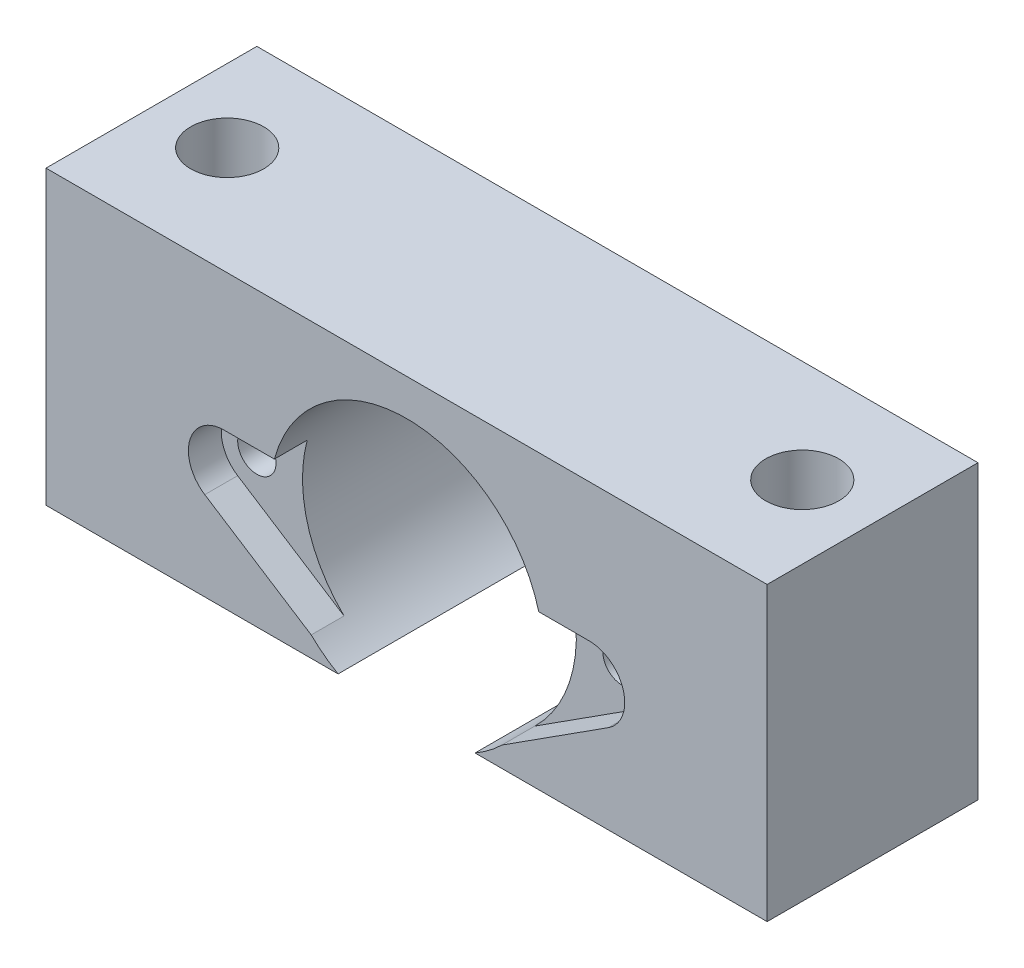
ISO-10303-21;
HEADER;
FILE_DESCRIPTION(('STEP AP214'),'2;1');
FILE_NAME('part.step','',(''),(''),'','','');
FILE_SCHEMA(('AUTOMOTIVE_DESIGN { 1 0 10303 214 1 1 1 1 }'));
ENDSEC;
DATA;
#1=APPLICATION_CONTEXT('core data for automotive mechanical design processes');
#2=APPLICATION_PROTOCOL_DEFINITION('international standard','automotive_design',2000,#1);
#3=PRODUCT_CONTEXT('',#1,'mechanical');
#4=PRODUCT('Part','Part','',(#3));
#5=PRODUCT_RELATED_PRODUCT_CATEGORY('part','',(#4));
#6=PRODUCT_DEFINITION_FORMATION('','',#4);
#7=PRODUCT_DEFINITION_CONTEXT('part definition',#1,'design');
#8=PRODUCT_DEFINITION('design','',#6,#7);
#9=PRODUCT_DEFINITION_SHAPE('','',#8);
#10=(LENGTH_UNIT() NAMED_UNIT(*) SI_UNIT(.MILLI.,.METRE.));
#11=(NAMED_UNIT(*) PLANE_ANGLE_UNIT() SI_UNIT($,.RADIAN.));
#12=(NAMED_UNIT(*) SI_UNIT($,.STERADIAN.) SOLID_ANGLE_UNIT());
#13=UNCERTAINTY_MEASURE_WITH_UNIT(LENGTH_MEASURE(1.E-05),#10,'distance_accuracy_value','');
#14=(GEOMETRIC_REPRESENTATION_CONTEXT(3) GLOBAL_UNCERTAINTY_ASSIGNED_CONTEXT((#13)) GLOBAL_UNIT_ASSIGNED_CONTEXT((#10,
#11,#12)) REPRESENTATION_CONTEXT('',''));
#15=CARTESIAN_POINT('',(0.,0.,0.));
#16=DIRECTION('',(0.,0.,1.));
#17=DIRECTION('',(1.,0.,0.));
#18=AXIS2_PLACEMENT_3D('',#15,#16,#17);
#19=CARTESIAN_POINT('',(19.75,9.49999999999992,-47.1207938497077));
#20=DIRECTION('',(-1.,0.,0.));
#21=DIRECTION('',(0.,0.,1.));
#22=AXIS2_PLACEMENT_3D('',#19,#20,#21);
#23=PLANE('',#22);
#24=DIRECTION('',(0.,-1.,0.));
#25=VECTOR('',#24,1.);
#26=CARTESIAN_POINT('',(19.75,9.49999999999992,-35.5707938497077));
#27=LINE('',#26,#25);
#28=CARTESIAN_POINT('',(19.75,9.49999999999992,-35.5707938497077));
#29=VERTEX_POINT('',#28);
#30=CARTESIAN_POINT('',(19.75,-6.49519052838343,-35.5707938497077));
#31=VERTEX_POINT('',#30);
#32=EDGE_CURVE('E179',#29,#31,#27,.T.);
#33=ORIENTED_EDGE('',*,*,#32,.T.);
#34=DIRECTION('',(0.,0.,1.));
#35=VECTOR('',#34,1.);
#36=CARTESIAN_POINT('',(19.75,-6.49519052838343,-47.1207938497077));
#37=LINE('',#36,#35);
#38=CARTESIAN_POINT('',(19.75,-6.49519052838343,-47.1207938497077));
#39=VERTEX_POINT('',#38);
#40=EDGE_CURVE('E11',#39,#31,#37,.T.);
#41=ORIENTED_EDGE('',*,*,#40,.F.);
#42=DIRECTION('',(0.,-1.,0.));
#43=VECTOR('',#42,1.);
#44=CARTESIAN_POINT('',(19.75,9.49999999999992,-47.1207938497077));
#45=LINE('',#44,#43);
#46=CARTESIAN_POINT('',(19.75,9.49999999999992,-47.1207938497077));
#47=VERTEX_POINT('',#46);
#48=EDGE_CURVE('E210',#47,#39,#45,.T.);
#49=ORIENTED_EDGE('',*,*,#48,.F.);
#50=DIRECTION('',(0.,0.,1.));
#51=VECTOR('',#50,1.);
#52=CARTESIAN_POINT('',(19.75,9.49999999999992,-47.1207938497077));
#53=LINE('',#52,#51);
#54=EDGE_CURVE('E225',#47,#29,#53,.T.);
#55=ORIENTED_EDGE('',*,*,#54,.T.);
#56=EDGE_LOOP('',(#33,#41,#49,#55));
#57=FACE_BOUND('',#56,.T.);
#58=ADVANCED_FACE('F39',(#57),#23,.F.);
#59=CARTESIAN_POINT('',(19.75,-6.49519052838343,-47.1207938497077));
#60=DIRECTION('',(0.,1.,0.));
#61=DIRECTION('',(0.,0.,1.));
#62=AXIS2_PLACEMENT_3D('',#59,#60,#61);
#63=PLANE('',#62);
#64=CARTESIAN_POINT('',(15.75,-6.49519052838343,-41.4957938497077));
#65=DIRECTION('',(0.,1.,0.));
#66=DIRECTION('',(0.,0.,1.));
#67=AXIS2_PLACEMENT_3D('',#64,#65,#66);
#68=CIRCLE('',#67,2.00000000000001);
#69=CARTESIAN_POINT('',(15.75,-6.49519052838343,-39.4957938497077));
#70=VERTEX_POINT('',#69);
#71=EDGE_CURVE('E312',#70,#70,#68,.T.);
#72=ORIENTED_EDGE('',*,*,#71,.T.);
#73=EDGE_LOOP('',(#72));
#74=FACE_BOUND('',#73,.T.);
#75=DIRECTION('',(-1.,0.,0.));
#76=VECTOR('',#75,1.);
#77=CARTESIAN_POINT('',(19.75,-6.49519052838343,-35.5707938497077));
#78=LINE('',#77,#76);
#79=CARTESIAN_POINT('',(3.75,-6.49519052838343,-35.5707938497077));
#80=VERTEX_POINT('',#79);
#81=EDGE_CURVE('E228',#31,#80,#78,.T.);
#82=ORIENTED_EDGE('',*,*,#81,.T.);
#83=DIRECTION('',(0.,0.,1.));
#84=VECTOR('',#83,1.);
#85=CARTESIAN_POINT('',(3.75,-6.49519052838343,-47.1207938497077));
#86=LINE('',#85,#84);
#87=CARTESIAN_POINT('',(3.75,-6.49519052838343,-47.1207938497077));
#88=VERTEX_POINT('',#87);
#89=EDGE_CURVE('E46',#88,#80,#86,.T.);
#90=ORIENTED_EDGE('',*,*,#89,.F.);
#91=DIRECTION('',(-1.,0.,0.));
#92=VECTOR('',#91,1.);
#93=CARTESIAN_POINT('',(19.75,-6.49519052838343,-47.1207938497077));
#94=LINE('',#93,#92);
#95=EDGE_CURVE('E213',#39,#88,#94,.T.);
#96=ORIENTED_EDGE('',*,*,#95,.F.);
#97=ORIENTED_EDGE('',*,*,#40,.T.);
#98=EDGE_LOOP('',(#82,#90,#96,#97));
#99=FACE_BOUND('',#98,.T.);
#100=ADVANCED_FACE('F254',(#74,#99),#63,.F.);
#101=CARTESIAN_POINT('',(0.,-1.04791218874173E-13,-47.1207938497077));
#102=DIRECTION('',(0.,0.,1.));
#103=DIRECTION('',(1.,0.,0.));
#104=AXIS2_PLACEMENT_3D('',#101,#102,#103);
#105=CYLINDRICAL_SURFACE('',#104,7.50000000000003);
#106=DIRECTION('',(0.,0.,1.));
#107=VECTOR('',#106,1.);
#108=CARTESIAN_POINT('',(7.24206462274403,1.94999999999986,-37.3707938497077));
#109=LINE('',#108,#107);
#110=CARTESIAN_POINT('',(7.24206462274403,1.94999999999986,-37.3707938497077));
#111=VERTEX_POINT('',#110);
#112=CARTESIAN_POINT('',(7.24206462274403,1.94999999999986,-35.5707938497077));
#113=VERTEX_POINT('',#112);
#114=EDGE_CURVE('E141',#111,#113,#109,.T.);
#115=ORIENTED_EDGE('',*,*,#114,.T.);
#116=CARTESIAN_POINT('',(0.,-1.04791218874173E-13,-35.5707938497077));
#117=DIRECTION('',(0.,0.,-1.));
#118=DIRECTION('',(-1.,0.,0.));
#119=AXIS2_PLACEMENT_3D('',#116,#117,#118);
#120=CIRCLE('',#119,7.50000000000003);
#121=CARTESIAN_POINT('',(-7.24206462274403,1.94999999999985,-35.5707938497077));
#122=VERTEX_POINT('',#121);
#123=EDGE_CURVE('E236',#122,#113,#120,.T.);
#124=ORIENTED_EDGE('',*,*,#123,.F.);
#125=DIRECTION('',(0.,0.,1.));
#126=VECTOR('',#125,1.);
#127=CARTESIAN_POINT('',(-7.24206462274403,1.94999999999985,-37.3707938497077));
#128=LINE('',#127,#126);
#129=CARTESIAN_POINT('',(-7.24206462274403,1.94999999999985,-37.3707938497077));
#130=VERTEX_POINT('',#129);
#131=EDGE_CURVE('E61',#130,#122,#128,.T.);
#132=ORIENTED_EDGE('',*,*,#131,.F.);
#133=CARTESIAN_POINT('',(0.,-1.04791218874173E-13,-37.3707938497077));
#134=DIRECTION('',(0.,0.,1.));
#135=DIRECTION('',(1.,0.,0.));
#136=AXIS2_PLACEMENT_3D('',#133,#134,#135);
#137=CIRCLE('',#136,7.50000000000003);
#138=CARTESIAN_POINT('',(-5.2251691765045,-5.38029804721902,-37.3707938497077));
#139=VERTEX_POINT('',#138);
#140=EDGE_CURVE('E186',#139,#130,#137,.F.);
#141=ORIENTED_EDGE('',*,*,#140,.F.);
#142=DIRECTION('',(0.,0.,1.));
#143=VECTOR('',#142,1.);
#144=CARTESIAN_POINT('',(-5.2251691765045,-5.38029804721902,-37.3707938497077));
#145=LINE('',#144,#143);
#146=CARTESIAN_POINT('',(-5.2251691765045,-5.38029804721902,-35.5707938497077));
#147=VERTEX_POINT('',#146);
#148=EDGE_CURVE('E196',#139,#147,#145,.T.);
#149=ORIENTED_EDGE('',*,*,#148,.T.);
#150=CARTESIAN_POINT('',(-3.74999999999999,-6.49519052838343,-35.5707938497077));
#151=VERTEX_POINT('',#150);
#152=EDGE_CURVE('E232',#151,#147,#120,.T.);
#153=ORIENTED_EDGE('',*,*,#152,.F.);
#154=DIRECTION('',(0.,0.,1.));
#155=VECTOR('',#154,1.);
#156=CARTESIAN_POINT('',(-3.74999999999999,-6.49519052838343,-47.1207938497077));
#157=LINE('',#156,#155);
#158=CARTESIAN_POINT('',(-3.74999999999999,-6.49519052838343,-47.1207938497077));
#159=VERTEX_POINT('',#158);
#160=EDGE_CURVE('E249',#159,#151,#157,.T.);
#161=ORIENTED_EDGE('',*,*,#160,.F.);
#162=CARTESIAN_POINT('',(0.,-1.04791218874173E-13,-47.1207938497077));
#163=DIRECTION('',(0.,0.,-1.));
#164=DIRECTION('',(-1.,0.,0.));
#165=AXIS2_PLACEMENT_3D('',#162,#163,#164);
#166=CIRCLE('',#165,7.50000000000003);
#167=EDGE_CURVE('E216',#159,#88,#166,.T.);
#168=ORIENTED_EDGE('',*,*,#167,.T.);
#169=ORIENTED_EDGE('',*,*,#89,.T.);
#170=CARTESIAN_POINT('',(5.22516917650451,-5.38029804721902,-35.5707938497077));
#171=VERTEX_POINT('',#170);
#172=EDGE_CURVE('E231',#171,#80,#120,.T.);
#173=ORIENTED_EDGE('',*,*,#172,.F.);
#174=DIRECTION('',(0.,0.,1.));
#175=VECTOR('',#174,1.);
#176=CARTESIAN_POINT('',(5.22516917650451,-5.38029804721902,-37.3707938497077));
#177=LINE('',#176,#175);
#178=CARTESIAN_POINT('',(5.22516917650451,-5.38029804721902,-37.3707938497077));
#179=VERTEX_POINT('',#178);
#180=EDGE_CURVE('E53',#179,#171,#177,.T.);
#181=ORIENTED_EDGE('',*,*,#180,.F.);
#182=CARTESIAN_POINT('',(0.,-1.04791218874173E-13,-37.3707938497077));
#183=DIRECTION('',(0.,0.,1.));
#184=DIRECTION('',(1.,0.,0.));
#185=AXIS2_PLACEMENT_3D('',#182,#183,#184);
#186=CIRCLE('',#185,7.50000000000003);
#187=EDGE_CURVE('E159',#111,#179,#186,.F.);
#188=ORIENTED_EDGE('',*,*,#187,.F.);
#189=EDGE_LOOP('',(#115,#124,#132,#141,#149,#153,#161,#168,#169,#173,#181,#188));
#190=FACE_BOUND('',#189,.T.);
#191=ADVANCED_FACE('F163',(#190),#105,.F.);
#192=CARTESIAN_POINT('',(-3.74999999999999,-6.49519052838343,-47.1207938497077));
#193=DIRECTION('',(0.,1.,0.));
#194=DIRECTION('',(0.,0.,1.));
#195=AXIS2_PLACEMENT_3D('',#192,#193,#194);
#196=PLANE('',#195);
#197=CARTESIAN_POINT('',(-15.75,-6.49519052838343,-41.4957938497077));
#198=DIRECTION('',(0.,1.,0.));
#199=DIRECTION('',(0.,0.,1.));
#200=AXIS2_PLACEMENT_3D('',#197,#198,#199);
#201=CIRCLE('',#200,2.);
#202=CARTESIAN_POINT('',(-15.75,-6.49519052838343,-39.4957938497077));
#203=VERTEX_POINT('',#202);
#204=EDGE_CURVE('E328',#203,#203,#201,.T.);
#205=ORIENTED_EDGE('',*,*,#204,.T.);
#206=EDGE_LOOP('',(#205));
#207=FACE_BOUND('',#206,.T.);
#208=DIRECTION('',(-1.,0.,0.));
#209=VECTOR('',#208,1.);
#210=CARTESIAN_POINT('',(-3.74999999999999,-6.49519052838343,-35.5707938497077));
#211=LINE('',#210,#209);
#212=CARTESIAN_POINT('',(-19.75,-6.49519052838343,-35.5707938497077));
#213=VERTEX_POINT('',#212);
#214=EDGE_CURVE('E235',#151,#213,#211,.T.);
#215=ORIENTED_EDGE('',*,*,#214,.T.);
#216=DIRECTION('',(0.,0.,1.));
#217=VECTOR('',#216,1.);
#218=CARTESIAN_POINT('',(-19.75,-6.49519052838343,-47.1207938497077));
#219=LINE('',#218,#217);
#220=CARTESIAN_POINT('',(-19.75,-6.49519052838343,-47.1207938497077));
#221=VERTEX_POINT('',#220);
#222=EDGE_CURVE('E246',#221,#213,#219,.T.);
#223=ORIENTED_EDGE('',*,*,#222,.F.);
#224=DIRECTION('',(-1.,0.,0.));
#225=VECTOR('',#224,1.);
#226=CARTESIAN_POINT('',(-3.74999999999999,-6.49519052838343,-47.1207938497077));
#227=LINE('',#226,#225);
#228=EDGE_CURVE('E219',#159,#221,#227,.T.);
#229=ORIENTED_EDGE('',*,*,#228,.F.);
#230=ORIENTED_EDGE('',*,*,#160,.T.);
#231=EDGE_LOOP('',(#215,#223,#229,#230));
#232=FACE_BOUND('',#231,.T.);
#233=ADVANCED_FACE('F276',(#207,#232),#196,.F.);
#234=CARTESIAN_POINT('',(-19.75,-6.49519052838343,-47.1207938497077));
#235=DIRECTION('',(1.,0.,0.));
#236=DIRECTION('',(0.,1.,0.));
#237=AXIS2_PLACEMENT_3D('',#234,#235,#236);
#238=PLANE('',#237);
#239=DIRECTION('',(0.,1.,0.));
#240=VECTOR('',#239,1.);
#241=CARTESIAN_POINT('',(-19.75,-6.49519052838343,-35.5707938497077));
#242=LINE('',#241,#240);
#243=CARTESIAN_POINT('',(-19.75,9.49999999999992,-35.5707938497077));
#244=VERTEX_POINT('',#243);
#245=EDGE_CURVE('E238',#213,#244,#242,.T.);
#246=ORIENTED_EDGE('',*,*,#245,.T.);
#247=DIRECTION('',(0.,0.,1.));
#248=VECTOR('',#247,1.);
#249=CARTESIAN_POINT('',(-19.75,9.49999999999992,-47.1207938497077));
#250=LINE('',#249,#248);
#251=CARTESIAN_POINT('',(-19.75,9.49999999999992,-47.1207938497077));
#252=VERTEX_POINT('',#251);
#253=EDGE_CURVE('E243',#252,#244,#250,.T.);
#254=ORIENTED_EDGE('',*,*,#253,.F.);
#255=DIRECTION('',(0.,1.,0.));
#256=VECTOR('',#255,1.);
#257=CARTESIAN_POINT('',(-19.75,-6.49519052838343,-47.1207938497077));
#258=LINE('',#257,#256);
#259=EDGE_CURVE('E221',#221,#252,#258,.T.);
#260=ORIENTED_EDGE('',*,*,#259,.F.);
#261=ORIENTED_EDGE('',*,*,#222,.T.);
#262=EDGE_LOOP('',(#246,#254,#260,#261));
#263=FACE_BOUND('',#262,.T.);
#264=ADVANCED_FACE('F288',(#263),#238,.F.);
#265=CARTESIAN_POINT('',(-19.75,9.49999999999992,-47.1207938497077));
#266=DIRECTION('',(0.,-1.,0.));
#267=DIRECTION('',(0.,0.,-1.));
#268=AXIS2_PLACEMENT_3D('',#265,#266,#267);
#269=PLANE('',#268);
#270=CARTESIAN_POINT('',(-15.75,9.49999999999992,-41.4957938497077));
#271=DIRECTION('',(0.,1.,0.));
#272=DIRECTION('',(0.,0.,1.));
#273=AXIS2_PLACEMENT_3D('',#270,#271,#272);
#274=CIRCLE('',#273,2.);
#275=CARTESIAN_POINT('',(-15.75,9.49999999999992,-39.4957938497077));
#276=VERTEX_POINT('',#275);
#277=EDGE_CURVE('E317',#276,#276,#274,.T.);
#278=ORIENTED_EDGE('',*,*,#277,.F.);
#279=EDGE_LOOP('',(#278));
#280=FACE_BOUND('',#279,.T.);
#281=CARTESIAN_POINT('',(15.75,9.49999999999992,-41.4957938497077));
#282=DIRECTION('',(0.,1.,0.));
#283=DIRECTION('',(0.,0.,1.));
#284=AXIS2_PLACEMENT_3D('',#281,#282,#283);
#285=CIRCLE('',#284,2.00000000000001);
#286=CARTESIAN_POINT('',(15.75,9.49999999999992,-39.4957938497077));
#287=VERTEX_POINT('',#286);
#288=EDGE_CURVE('E314',#287,#287,#285,.T.);
#289=ORIENTED_EDGE('',*,*,#288,.F.);
#290=EDGE_LOOP('',(#289));
#291=FACE_BOUND('',#290,.T.);
#292=DIRECTION('',(1.,0.,0.));
#293=VECTOR('',#292,1.);
#294=CARTESIAN_POINT('',(-19.75,9.49999999999992,-35.5707938497077));
#295=LINE('',#294,#293);
#296=EDGE_CURVE('E214',#244,#29,#295,.T.);
#297=ORIENTED_EDGE('',*,*,#296,.T.);
#298=ORIENTED_EDGE('',*,*,#54,.F.);
#299=DIRECTION('',(1.,0.,0.));
#300=VECTOR('',#299,1.);
#301=CARTESIAN_POINT('',(-19.75,9.49999999999992,-47.1207938497077));
#302=LINE('',#301,#300);
#303=EDGE_CURVE('E223',#252,#47,#302,.T.);
#304=ORIENTED_EDGE('',*,*,#303,.F.);
#305=ORIENTED_EDGE('',*,*,#253,.T.);
#306=EDGE_LOOP('',(#297,#298,#304,#305));
#307=FACE_BOUND('',#306,.T.);
#308=ADVANCED_FACE('F285',(#280,#291,#307),#269,.F.);
#309=CARTESIAN_POINT('',(0.,-1.04791218874173E-13,-47.1207938497077));
#310=DIRECTION('',(0.,0.,-1.));
#311=DIRECTION('',(-1.,0.,0.));
#312=AXIS2_PLACEMENT_3D('',#309,#310,#311);
#313=PLANE('',#312);
#314=ORIENTED_EDGE('',*,*,#48,.T.);
#315=ORIENTED_EDGE('',*,*,#95,.T.);
#316=ORIENTED_EDGE('',*,*,#167,.F.);
#317=ORIENTED_EDGE('',*,*,#228,.T.);
#318=ORIENTED_EDGE('',*,*,#259,.T.);
#319=ORIENTED_EDGE('',*,*,#303,.T.);
#320=EDGE_LOOP('',(#314,#315,#316,#317,#318,#319));
#321=FACE_BOUND('',#320,.T.);
#322=ADVANCED_FACE('F279',(#321),#313,.T.);
#323=CARTESIAN_POINT('',(0.,-1.04791218874173E-13,-35.5707938497077));
#324=DIRECTION('',(0.,0.,-1.));
#325=DIRECTION('',(-1.,0.,0.));
#326=AXIS2_PLACEMENT_3D('',#323,#324,#325);
#327=PLANE('',#326);
#328=ORIENTED_EDGE('',*,*,#123,.T.);
#329=DIRECTION('',(-1.,0.,0.));
#330=VECTOR('',#329,1.);
#331=CARTESIAN_POINT('',(0.,1.94999999999987,-35.5707938497077));
#332=LINE('',#331,#330);
#333=CARTESIAN_POINT('',(10.,1.94999999999985,-35.5707938497077));
#334=VERTEX_POINT('',#333);
#335=EDGE_CURVE('E147',#334,#113,#332,.T.);
#336=ORIENTED_EDGE('',*,*,#335,.F.);
#337=CARTESIAN_POINT('',(10.,-1.40475960755004E-13,-35.5707938497077));
#338=DIRECTION('',(0.,0.,1.));
#339=DIRECTION('',(1.,0.,0.));
#340=AXIS2_PLACEMENT_3D('',#337,#338,#339);
#341=CIRCLE('',#340,1.95);
#342=CARTESIAN_POINT('',(11.053,-1.6412467821752,-35.5707938497077));
#343=VERTEX_POINT('',#342);
#344=EDGE_CURVE('E161',#343,#334,#341,.T.);
#345=ORIENTED_EDGE('',*,*,#344,.F.);
#346=DIRECTION('',(0.841665016500033,0.54,0.));
#347=VECTOR('',#346,1.);
#348=CARTESIAN_POINT('',(3.96900000000007,-6.18623787127534,-35.5707938497077));
#349=LINE('',#348,#347);
#350=EDGE_CURVE('E172',#171,#343,#349,.T.);
#351=ORIENTED_EDGE('',*,*,#350,.F.);
#352=ORIENTED_EDGE('',*,*,#172,.T.);
#353=ORIENTED_EDGE('',*,*,#81,.F.);
#354=ORIENTED_EDGE('',*,*,#32,.F.);
#355=ORIENTED_EDGE('',*,*,#296,.F.);
#356=ORIENTED_EDGE('',*,*,#245,.F.);
#357=ORIENTED_EDGE('',*,*,#214,.F.);
#358=ORIENTED_EDGE('',*,*,#152,.T.);
#359=DIRECTION('',(0.841665016500033,-0.54,0.));
#360=VECTOR('',#359,1.);
#361=CARTESIAN_POINT('',(-3.96900000000006,-6.18623787127534,-35.5707938497077));
#362=LINE('',#361,#360);
#363=CARTESIAN_POINT('',(-11.053,-1.6412467821752,-35.5707938497077));
#364=VERTEX_POINT('',#363);
#365=EDGE_CURVE('E197',#364,#147,#362,.T.);
#366=ORIENTED_EDGE('',*,*,#365,.F.);
#367=CARTESIAN_POINT('',(-9.99999999999999,-1.44222963463114E-13,-35.5707938497077));
#368=DIRECTION('',(0.,0.,1.));
#369=DIRECTION('',(1.,0.,0.));
#370=AXIS2_PLACEMENT_3D('',#367,#368,#369);
#371=CIRCLE('',#370,1.95);
#372=CARTESIAN_POINT('',(-9.99999999999999,1.94999999999986,-35.5707938497077));
#373=VERTEX_POINT('',#372);
#374=EDGE_CURVE('E187',#373,#364,#371,.T.);
#375=ORIENTED_EDGE('',*,*,#374,.F.);
#376=DIRECTION('',(-1.,0.,0.));
#377=VECTOR('',#376,1.);
#378=CARTESIAN_POINT('',(0.,1.94999999999986,-35.5707938497077));
#379=LINE('',#378,#377);
#380=EDGE_CURVE('E199',#122,#373,#379,.T.);
#381=ORIENTED_EDGE('',*,*,#380,.F.);
#382=EDGE_LOOP('',(#328,#336,#345,#351,#352,#353,#354,#355,#356,#357,#358,#366,#375,#381));
#383=FACE_BOUND('',#382,.T.);
#384=ADVANCED_FACE('F258',(#383),#327,.F.);
#385=CARTESIAN_POINT('',(-3.96900000000006,-6.18623787127534,-37.3707938497077));
#386=DIRECTION('',(-0.54,-0.841665016500033,0.));
#387=DIRECTION('',(0.841665016500033,-0.54,0.));
#388=AXIS2_PLACEMENT_3D('',#385,#386,#387);
#389=PLANE('',#388);
#390=ORIENTED_EDGE('',*,*,#365,.T.);
#391=ORIENTED_EDGE('',*,*,#148,.F.);
#392=DIRECTION('',(0.841665016500033,-0.54,0.));
#393=VECTOR('',#392,1.);
#394=CARTESIAN_POINT('',(-3.96900000000006,-6.18623787127534,-37.3707938497077));
#395=LINE('',#394,#393);
#396=CARTESIAN_POINT('',(-11.053,-1.6412467821752,-37.3707938497077));
#397=VERTEX_POINT('',#396);
#398=EDGE_CURVE('E183',#397,#139,#395,.T.);
#399=ORIENTED_EDGE('',*,*,#398,.F.);
#400=DIRECTION('',(0.,0.,1.));
#401=VECTOR('',#400,1.);
#402=CARTESIAN_POINT('',(-11.053,-1.6412467821752,-37.3707938497077));
#403=LINE('',#402,#401);
#404=EDGE_CURVE('E173',#397,#364,#403,.T.);
#405=ORIENTED_EDGE('',*,*,#404,.T.);
#406=EDGE_LOOP('',(#390,#391,#399,#405));
#407=FACE_BOUND('',#406,.T.);
#408=ADVANCED_FACE('F269',(#407),#389,.F.);
#409=CARTESIAN_POINT('',(-9.99999999999999,-1.44222963463114E-13,-37.3707938497077));
#410=DIRECTION('',(0.,0.,1.));
#411=DIRECTION('',(1.,0.,0.));
#412=AXIS2_PLACEMENT_3D('',#409,#410,#411);
#413=CYLINDRICAL_SURFACE('',#412,1.95);
#414=ORIENTED_EDGE('',*,*,#374,.T.);
#415=ORIENTED_EDGE('',*,*,#404,.F.);
#416=CARTESIAN_POINT('',(-9.99999999999999,-1.44222963463114E-13,-37.3707938497077));
#417=DIRECTION('',(0.,0.,1.));
#418=DIRECTION('',(1.,0.,0.));
#419=AXIS2_PLACEMENT_3D('',#416,#417,#418);
#420=CIRCLE('',#419,1.95);
#421=CARTESIAN_POINT('',(-9.99999999999999,1.94999999999986,-37.3707938497077));
#422=VERTEX_POINT('',#421);
#423=EDGE_CURVE('E193',#422,#397,#420,.T.);
#424=ORIENTED_EDGE('',*,*,#423,.F.);
#425=DIRECTION('',(0.,0.,1.));
#426=VECTOR('',#425,1.);
#427=CARTESIAN_POINT('',(-9.99999999999999,1.94999999999986,-37.3707938497077));
#428=LINE('',#427,#426);
#429=EDGE_CURVE('E205',#422,#373,#428,.T.);
#430=ORIENTED_EDGE('',*,*,#429,.T.);
#431=EDGE_LOOP('',(#414,#415,#424,#430));
#432=FACE_BOUND('',#431,.T.);
#433=ADVANCED_FACE('F345',(#432),#413,.F.);
#434=CARTESIAN_POINT('',(0.,1.94999999999986,-37.3707938497077));
#435=DIRECTION('',(0.,1.,0.));
#436=DIRECTION('',(-1.,0.,0.));
#437=AXIS2_PLACEMENT_3D('',#434,#435,#436);
#438=PLANE('',#437);
#439=ORIENTED_EDGE('',*,*,#380,.T.);
#440=ORIENTED_EDGE('',*,*,#429,.F.);
#441=DIRECTION('',(-1.,0.,0.));
#442=VECTOR('',#441,1.);
#443=CARTESIAN_POINT('',(0.,1.94999999999986,-37.3707938497077));
#444=LINE('',#443,#442);
#445=EDGE_CURVE('E190',#130,#422,#444,.T.);
#446=ORIENTED_EDGE('',*,*,#445,.F.);
#447=ORIENTED_EDGE('',*,*,#131,.T.);
#448=EDGE_LOOP('',(#439,#440,#446,#447));
#449=FACE_BOUND('',#448,.T.);
#450=ADVANCED_FACE('F337',(#449),#438,.F.);
#451=CARTESIAN_POINT('',(0.,0.,-37.3707938497077));
#452=DIRECTION('',(0.,0.,1.));
#453=DIRECTION('',(1.,0.,0.));
#454=AXIS2_PLACEMENT_3D('',#451,#452,#453);
#455=PLANE('',#454);
#456=CARTESIAN_POINT('',(-9.99999999999999,-1.40288518418392E-13,-37.3707938497077));
#457=DIRECTION('',(0.,0.,1.));
#458=DIRECTION('',(1.,0.,0.));
#459=AXIS2_PLACEMENT_3D('',#456,#457,#458);
#460=CIRCLE('',#459,1.05);
#461=CARTESIAN_POINT('',(-8.94999999999999,-1.40288518418392E-13,-37.3707938497077));
#462=VERTEX_POINT('',#461);
#463=EDGE_CURVE('E200',#462,#462,#460,.T.);
#464=ORIENTED_EDGE('',*,*,#463,.F.);
#465=EDGE_LOOP('',(#464));
#466=FACE_BOUND('',#465,.T.);
#467=ORIENTED_EDGE('',*,*,#398,.T.);
#468=ORIENTED_EDGE('',*,*,#140,.T.);
#469=ORIENTED_EDGE('',*,*,#445,.T.);
#470=ORIENTED_EDGE('',*,*,#423,.T.);
#471=EDGE_LOOP('',(#467,#468,#469,#470));
#472=FACE_BOUND('',#471,.T.);
#473=ADVANCED_FACE('F265',(#466,#472),#455,.T.);
#474=CARTESIAN_POINT('',(0.,1.94999999999987,-37.3707938497077));
#475=DIRECTION('',(0.,1.,0.));
#476=DIRECTION('',(-1.,0.,0.));
#477=AXIS2_PLACEMENT_3D('',#474,#475,#476);
#478=PLANE('',#477);
#479=ORIENTED_EDGE('',*,*,#335,.T.);
#480=ORIENTED_EDGE('',*,*,#114,.F.);
#481=DIRECTION('',(-1.,0.,0.));
#482=VECTOR('',#481,1.);
#483=CARTESIAN_POINT('',(0.,1.94999999999987,-37.3707938497077));
#484=LINE('',#483,#482);
#485=CARTESIAN_POINT('',(10.,1.94999999999985,-37.3707938497077));
#486=VERTEX_POINT('',#485);
#487=EDGE_CURVE('E144',#486,#111,#484,.T.);
#488=ORIENTED_EDGE('',*,*,#487,.F.);
#489=DIRECTION('',(0.,0.,1.));
#490=VECTOR('',#489,1.);
#491=CARTESIAN_POINT('',(10.,1.94999999999985,-37.3707938497077));
#492=LINE('',#491,#490);
#493=EDGE_CURVE('E177',#486,#334,#492,.T.);
#494=ORIENTED_EDGE('',*,*,#493,.T.);
#495=EDGE_LOOP('',(#479,#480,#488,#494));
#496=FACE_BOUND('',#495,.T.);
#497=ADVANCED_FACE('F143',(#496),#478,.F.);
#498=CARTESIAN_POINT('',(10.,-1.40475960755004E-13,-37.3707938497077));
#499=DIRECTION('',(0.,0.,1.));
#500=DIRECTION('',(1.,0.,0.));
#501=AXIS2_PLACEMENT_3D('',#498,#499,#500);
#502=CYLINDRICAL_SURFACE('',#501,1.95);
#503=ORIENTED_EDGE('',*,*,#344,.T.);
#504=ORIENTED_EDGE('',*,*,#493,.F.);
#505=CARTESIAN_POINT('',(10.,-1.40475960755004E-13,-37.3707938497077));
#506=DIRECTION('',(0.,0.,1.));
#507=DIRECTION('',(1.,0.,0.));
#508=AXIS2_PLACEMENT_3D('',#505,#506,#507);
#509=CIRCLE('',#508,1.95);
#510=CARTESIAN_POINT('',(11.053,-1.6412467821752,-37.3707938497077));
#511=VERTEX_POINT('',#510);
#512=EDGE_CURVE('E152',#511,#486,#509,.T.);
#513=ORIENTED_EDGE('',*,*,#512,.F.);
#514=DIRECTION('',(0.,0.,1.));
#515=VECTOR('',#514,1.);
#516=CARTESIAN_POINT('',(11.053,-1.6412467821752,-37.3707938497077));
#517=LINE('',#516,#515);
#518=EDGE_CURVE('E180',#511,#343,#517,.T.);
#519=ORIENTED_EDGE('',*,*,#518,.T.);
#520=EDGE_LOOP('',(#503,#504,#513,#519));
#521=FACE_BOUND('',#520,.T.);
#522=ADVANCED_FACE('F343',(#521),#502,.F.);
#523=CARTESIAN_POINT('',(3.96900000000007,-6.18623787127534,-37.3707938497077));
#524=DIRECTION('',(0.54,-0.841665016500033,0.));
#525=DIRECTION('',(0.841665016500033,0.54,0.));
#526=AXIS2_PLACEMENT_3D('',#523,#524,#525);
#527=PLANE('',#526);
#528=ORIENTED_EDGE('',*,*,#350,.T.);
#529=ORIENTED_EDGE('',*,*,#518,.F.);
#530=DIRECTION('',(0.841665016500033,0.54,0.));
#531=VECTOR('',#530,1.);
#532=CARTESIAN_POINT('',(3.96900000000007,-6.18623787127534,-37.3707938497077));
#533=LINE('',#532,#531);
#534=EDGE_CURVE('E165',#179,#511,#533,.T.);
#535=ORIENTED_EDGE('',*,*,#534,.F.);
#536=ORIENTED_EDGE('',*,*,#180,.T.);
#537=EDGE_LOOP('',(#528,#529,#535,#536));
#538=FACE_BOUND('',#537,.T.);
#539=ADVANCED_FACE('F399',(#538),#527,.F.);
#540=CARTESIAN_POINT('',(0.,0.,-37.3707938497077));
#541=DIRECTION('',(0.,0.,1.));
#542=DIRECTION('',(1.,0.,0.));
#543=AXIS2_PLACEMENT_3D('',#540,#541,#542);
#544=PLANE('',#543);
#545=ORIENTED_EDGE('',*,*,#487,.T.);
#546=ORIENTED_EDGE('',*,*,#187,.T.);
#547=ORIENTED_EDGE('',*,*,#534,.T.);
#548=ORIENTED_EDGE('',*,*,#512,.T.);
#549=EDGE_LOOP('',(#545,#546,#547,#548));
#550=FACE_BOUND('',#549,.T.);
#551=CARTESIAN_POINT('',(10.,-1.34991713756845E-13,-37.3707938497077));
#552=DIRECTION('',(0.,0.,1.));
#553=DIRECTION('',(1.,0.,0.));
#554=AXIS2_PLACEMENT_3D('',#551,#552,#553);
#555=CIRCLE('',#554,1.05);
#556=CARTESIAN_POINT('',(11.05,-1.34991713756845E-13,-37.3707938497077));
#557=VERTEX_POINT('',#556);
#558=EDGE_CURVE('E324',#557,#557,#555,.T.);
#559=ORIENTED_EDGE('',*,*,#558,.F.);
#560=EDGE_LOOP('',(#559));
#561=FACE_BOUND('',#560,.T.);
#562=ADVANCED_FACE('F156',(#550,#561),#544,.T.);
#563=CARTESIAN_POINT('',(10.,-1.34991713756845E-13,-41.5707938497077));
#564=DIRECTION('',(0.,0.,1.));
#565=DIRECTION('',(1.,0.,0.));
#566=AXIS2_PLACEMENT_3D('',#563,#564,#565);
#567=CYLINDRICAL_SURFACE('',#566,1.05);
#568=ORIENTED_EDGE('',*,*,#558,.T.);
#569=EDGE_LOOP('',(#568));
#570=FACE_BOUND('',#569,.T.);
#571=CARTESIAN_POINT('',(10.,-1.34991713756845E-13,-41.5707938497077));
#572=DIRECTION('',(0.,0.,1.));
#573=DIRECTION('',(1.,0.,0.));
#574=AXIS2_PLACEMENT_3D('',#571,#572,#573);
#575=CIRCLE('',#574,1.05);
#576=CARTESIAN_POINT('',(11.05,-1.34991713756845E-13,-41.5707938497077));
#577=VERTEX_POINT('',#576);
#578=EDGE_CURVE('E321',#577,#577,#575,.T.);
#579=ORIENTED_EDGE('',*,*,#578,.F.);
#580=EDGE_LOOP('',(#579));
#581=FACE_BOUND('',#580,.T.);
#582=ADVANCED_FACE('F419',(#570,#581),#567,.F.);
#583=CARTESIAN_POINT('',(0.,0.,-41.5707938497077));
#584=DIRECTION('',(0.,0.,1.));
#585=DIRECTION('',(1.,0.,0.));
#586=AXIS2_PLACEMENT_3D('',#583,#584,#585);
#587=PLANE('',#586);
#588=ORIENTED_EDGE('',*,*,#578,.T.);
#589=EDGE_LOOP('',(#588));
#590=FACE_BOUND('',#589,.T.);
#591=ADVANCED_FACE('F431',(#590),#587,.T.);
#592=CARTESIAN_POINT('',(-9.99999999999999,-1.40288518418392E-13,-41.5707938497077));
#593=DIRECTION('',(0.,0.,1.));
#594=DIRECTION('',(1.,0.,0.));
#595=AXIS2_PLACEMENT_3D('',#592,#593,#594);
#596=CYLINDRICAL_SURFACE('',#595,1.05);
#597=ORIENTED_EDGE('',*,*,#463,.T.);
#598=EDGE_LOOP('',(#597));
#599=FACE_BOUND('',#598,.T.);
#600=CARTESIAN_POINT('',(-9.99999999999999,-1.40288518418392E-13,-41.5707938497077));
#601=DIRECTION('',(0.,0.,1.));
#602=DIRECTION('',(1.,0.,0.));
#603=AXIS2_PLACEMENT_3D('',#600,#601,#602);
#604=CIRCLE('',#603,1.05);
#605=CARTESIAN_POINT('',(-8.94999999999999,-1.40288518418392E-13,-41.5707938497077));
#606=VERTEX_POINT('',#605);
#607=EDGE_CURVE('E325',#606,#606,#604,.T.);
#608=ORIENTED_EDGE('',*,*,#607,.F.);
#609=EDGE_LOOP('',(#608));
#610=FACE_BOUND('',#609,.T.);
#611=ADVANCED_FACE('F333',(#599,#610),#596,.F.);
#612=CARTESIAN_POINT('',(0.,0.,-41.5707938497077));
#613=DIRECTION('',(0.,0.,1.));
#614=DIRECTION('',(1.,0.,0.));
#615=AXIS2_PLACEMENT_3D('',#612,#613,#614);
#616=PLANE('',#615);
#617=ORIENTED_EDGE('',*,*,#607,.T.);
#618=EDGE_LOOP('',(#617));
#619=FACE_BOUND('',#618,.T.);
#620=ADVANCED_FACE('F450',(#619),#616,.T.);
#621=CARTESIAN_POINT('',(15.75,-6.49519052838343,-41.4957938497077));
#622=DIRECTION('',(0.,1.,0.));
#623=DIRECTION('',(0.,0.,1.));
#624=AXIS2_PLACEMENT_3D('',#621,#622,#623);
#625=CYLINDRICAL_SURFACE('',#624,2.00000000000001);
#626=ORIENTED_EDGE('',*,*,#71,.F.);
#627=EDGE_LOOP('',(#626));
#628=FACE_BOUND('',#627,.T.);
#629=ORIENTED_EDGE('',*,*,#288,.T.);
#630=EDGE_LOOP('',(#629));
#631=FACE_BOUND('',#630,.T.);
#632=ADVANCED_FACE('F458',(#628,#631),#625,.F.);
#633=CARTESIAN_POINT('',(-15.75,-6.49519052838343,-41.4957938497077));
#634=DIRECTION('',(0.,1.,0.));
#635=DIRECTION('',(0.,0.,1.));
#636=AXIS2_PLACEMENT_3D('',#633,#634,#635);
#637=CYLINDRICAL_SURFACE('',#636,2.);
#638=ORIENTED_EDGE('',*,*,#204,.F.);
#639=EDGE_LOOP('',(#638));
#640=FACE_BOUND('',#639,.T.);
#641=ORIENTED_EDGE('',*,*,#277,.T.);
#642=EDGE_LOOP('',(#641));
#643=FACE_BOUND('',#642,.T.);
#644=ADVANCED_FACE('F468',(#640,#643),#637,.F.);
#645=CLOSED_SHELL('',(#58,#100,#191,#233,#264,#308,#322,#384,#408,#433,#450,#473,#497,#522,#539,
#562,#582,#591,#611,#620,#632,#644));
#646=MANIFOLD_SOLID_BREP('B2',#645);
#647=ADVANCED_BREP_SHAPE_REPRESENTATION('',(#18,#646),#14);
#648=SHAPE_DEFINITION_REPRESENTATION(#9,#647);
ENDSEC;
END-ISO-10303-21;
